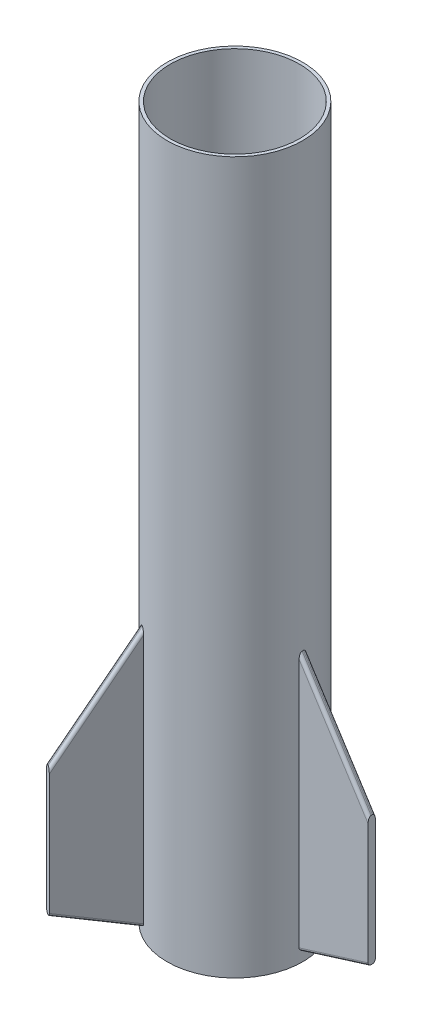
ISO-10303-21;
HEADER;
FILE_DESCRIPTION(('STEP AP214'),'2;1');
FILE_NAME('part.step','',(''),(''),'','','');
FILE_SCHEMA(('AUTOMOTIVE_DESIGN { 1 0 10303 214 1 1 1 1 }'));
ENDSEC;
DATA;
#1=APPLICATION_CONTEXT('core data for automotive mechanical design processes');
#2=APPLICATION_PROTOCOL_DEFINITION('international standard','automotive_design',2000,#1);
#3=PRODUCT_CONTEXT('',#1,'mechanical');
#4=PRODUCT('Part','Part','',(#3));
#5=PRODUCT_RELATED_PRODUCT_CATEGORY('part','',(#4));
#6=PRODUCT_DEFINITION_FORMATION('','',#4);
#7=PRODUCT_DEFINITION_CONTEXT('part definition',#1,'design');
#8=PRODUCT_DEFINITION('design','',#6,#7);
#9=PRODUCT_DEFINITION_SHAPE('','',#8);
#10=(LENGTH_UNIT() NAMED_UNIT(*) SI_UNIT(.MILLI.,.METRE.));
#11=(NAMED_UNIT(*) PLANE_ANGLE_UNIT() SI_UNIT($,.RADIAN.));
#12=(NAMED_UNIT(*) SI_UNIT($,.STERADIAN.) SOLID_ANGLE_UNIT());
#13=UNCERTAINTY_MEASURE_WITH_UNIT(LENGTH_MEASURE(1.E-05),#10,'distance_accuracy_value','');
#14=(GEOMETRIC_REPRESENTATION_CONTEXT(3) GLOBAL_UNCERTAINTY_ASSIGNED_CONTEXT((#13)) GLOBAL_UNIT_ASSIGNED_CONTEXT((#10,
#11,#12)) REPRESENTATION_CONTEXT('',''));
#15=CARTESIAN_POINT('',(0.,0.,0.));
#16=DIRECTION('',(0.,0.,1.));
#17=DIRECTION('',(1.,0.,0.));
#18=AXIS2_PLACEMENT_3D('',#15,#16,#17);
#19=CARTESIAN_POINT('',(-42.19224884677,19.05,-68.7611186881965));
#20=DIRECTION('',(-0.149137496567971,-0.95447997803503,-0.25831372136936));
#21=DIRECTION('',(-0.477239989017507,0.298274993135947,-0.826603908381953));
#22=AXIS2_PLACEMENT_3D('',#19,#20,#21);
#23=PLANE('',#22);
#24=DIRECTION('',(0.866025403784443,0.,-0.499999999999992));
#25=VECTOR('',#24,1.);
#26=CARTESIAN_POINT('',(-42.19224884677,19.05,-68.7611186881965));
#27=LINE('',#26,#25);
#28=CARTESIAN_POINT('',(-40.6524556788412,19.05,-69.6501186881964));
#29=VERTEX_POINT('',#28);
#30=CARTESIAN_POINT('',(-39.9925443211575,19.05,-70.0311186881964));
#31=VERTEX_POINT('',#30);
#32=EDGE_CURVE('E153',#29,#31,#27,.T.);
#33=ORIENTED_EDGE('',*,*,#32,.T.);
#34=DIRECTION('',(-0.477239989017507,0.298274993135947,-0.826603908381953));
#35=VECTOR('',#34,1.);
#36=CARTESIAN_POINT('',(-39.9925443211575,19.05,-70.0311186881964));
#37=LINE('',#36,#35);
#38=CARTESIAN_POINT('',(-19.6725443211578,6.35,-34.8358462783967));
#39=VERTEX_POINT('',#38);
#40=EDGE_CURVE('E121',#31,#39,#37,.F.);
#41=ORIENTED_EDGE('',*,*,#40,.T.);
#42=DIRECTION('',(0.866025403784443,0.,-0.499999999999992));
#43=VECTOR('',#42,1.);
#44=CARTESIAN_POINT('',(-21.8722488467703,6.35,-33.5658462783967));
#45=LINE('',#44,#43);
#46=CARTESIAN_POINT('',(-20.3324556788416,6.35,-34.4548462783967));
#47=VERTEX_POINT('',#46);
#48=EDGE_CURVE('E154',#47,#39,#45,.T.);
#49=ORIENTED_EDGE('',*,*,#48,.F.);
#50=DIRECTION('',(-0.477239989017507,0.298274993135947,-0.826603908381953));
#51=VECTOR('',#50,1.);
#52=CARTESIAN_POINT('',(-40.6524556788412,19.05,-69.6501186881964));
#53=LINE('',#52,#51);
#54=EDGE_CURVE('E126',#47,#29,#53,.T.);
#55=ORIENTED_EDGE('',*,*,#54,.T.);
#56=EDGE_LOOP('',(#33,#41,#49,#55));
#57=FACE_BOUND('',#56,.T.);
#58=ADVANCED_FACE('F51',(#57),#23,.T.);
#59=CARTESIAN_POINT('',(-21.8722488467703,6.35,-33.5658462783967));
#60=DIRECTION('',(0.499999999999992,0.,0.866025403784443));
#61=DIRECTION('',(0.866025403784443,0.,-0.499999999999992));
#62=AXIS2_PLACEMENT_3D('',#59,#60,#61);
#63=PLANE('',#62);
#64=ORIENTED_EDGE('',*,*,#48,.T.);
#65=CARTESIAN_POINT('',(-19.6725443211578,8.21279444400744,-34.8358462783967));
#66=DIRECTION('',(0.499999999999992,0.,0.866025403784443));
#67=DIRECTION('',(0.,1.,0.));
#68=AXIS2_PLACEMENT_3D('',#65,#66,#67);
#69=ELLIPSE('',#68,1.86279444400744,1.778);
#70=CARTESIAN_POINT('',(-18.1327511532291,8.21279444400744,-35.7248462783966));
#71=VERTEX_POINT('',#70);
#72=EDGE_CURVE('E175',#39,#71,#69,.T.);
#73=ORIENTED_EDGE('',*,*,#72,.T.);
#74=DIRECTION('',(0.,-1.,0.));
#75=VECTOR('',#74,1.);
#76=CARTESIAN_POINT('',(-18.1327511532291,6.35,-35.7248462783966));
#77=LINE('',#76,#75);
#78=CARTESIAN_POINT('',(-18.1327511532291,155.451627292796,-35.7248462783966));
#79=VERTEX_POINT('',#78);
#80=EDGE_CURVE('E137',#79,#71,#77,.T.);
#81=ORIENTED_EDGE('',*,*,#80,.F.);
#82=CARTESIAN_POINT('',(-19.6725443211578,155.451627292797,-34.8358462783967));
#83=DIRECTION('',(0.499999999999992,0.,0.866025403784443));
#84=DIRECTION('',(0.,1.,0.));
#85=AXIS2_PLACEMENT_3D('',#82,#83,#84);
#86=ELLIPSE('',#85,3.29837270720351,1.778);
#87=CARTESIAN_POINT('',(-19.6725443211578,158.75,-34.8358462783967));
#88=VERTEX_POINT('',#87);
#89=EDGE_CURVE('E171',#79,#88,#86,.T.);
#90=ORIENTED_EDGE('',*,*,#89,.T.);
#91=DIRECTION('',(0.866025403784443,0.,-0.499999999999992));
#92=VECTOR('',#91,1.);
#93=CARTESIAN_POINT('',(-21.8722488467703,158.75,-33.5658462783967));
#94=LINE('',#93,#92);
#95=CARTESIAN_POINT('',(-20.3324556788416,158.75,-34.4548462783967));
#96=VERTEX_POINT('',#95);
#97=EDGE_CURVE('E157',#96,#88,#94,.T.);
#98=ORIENTED_EDGE('',*,*,#97,.F.);
#99=CARTESIAN_POINT('',(-20.3324556788416,155.451627292797,-34.4548462783967));
#100=DIRECTION('',(0.499999999999992,0.,0.866025403784443));
#101=DIRECTION('',(0.,-1.,0.));
#102=AXIS2_PLACEMENT_3D('',#99,#100,#101);
#103=ELLIPSE('',#102,3.29837270720351,1.778);
#104=CARTESIAN_POINT('',(-21.8722488467703,155.451627292796,-33.5658462783967));
#105=VERTEX_POINT('',#104);
#106=EDGE_CURVE('E73',#96,#105,#103,.T.);
#107=ORIENTED_EDGE('',*,*,#106,.T.);
#108=DIRECTION('',(0.,-1.,0.));
#109=VECTOR('',#108,1.);
#110=CARTESIAN_POINT('',(-21.8722488467703,6.35,-33.5658462783967));
#111=LINE('',#110,#109);
#112=CARTESIAN_POINT('',(-21.8722488467703,8.21279444400744,-33.5658462783967));
#113=VERTEX_POINT('',#112);
#114=EDGE_CURVE('E151',#105,#113,#111,.T.);
#115=ORIENTED_EDGE('',*,*,#114,.T.);
#116=CARTESIAN_POINT('',(-20.3324556788416,8.21279444400744,-34.4548462783967));
#117=DIRECTION('',(0.499999999999992,0.,0.866025403784443));
#118=DIRECTION('',(0.,-1.,0.));
#119=AXIS2_PLACEMENT_3D('',#116,#117,#118);
#120=ELLIPSE('',#119,1.86279444400744,1.778);
#121=EDGE_CURVE('E173',#113,#47,#120,.T.);
#122=ORIENTED_EDGE('',*,*,#121,.T.);
#123=EDGE_LOOP('',(#64,#73,#81,#90,#98,#107,#115,#122));
#124=FACE_BOUND('',#123,.T.);
#125=ADVANCED_FACE('F187',(#124),#63,.T.);
#126=CARTESIAN_POINT('',(-21.8722488467703,158.75,-33.5658462783967));
#127=DIRECTION('',(-0.421135700330749,0.539053696423367,-0.729428429853974));
#128=DIRECTION('',(0.269526848211679,0.842271400661511,0.466834195106543));
#129=AXIS2_PLACEMENT_3D('',#126,#127,#128);
#130=PLANE('',#129);
#131=ORIENTED_EDGE('',*,*,#97,.T.);
#132=DIRECTION('',(0.269526848211679,0.842271400661511,0.466834195106543));
#133=VECTOR('',#132,1.);
#134=CARTESIAN_POINT('',(-19.6725443211578,158.75,-34.8358462783967));
#135=LINE('',#134,#133);
#136=CARTESIAN_POINT('',(-39.9925443211575,95.25,-70.0311186881964));
#137=VERTEX_POINT('',#136);
#138=EDGE_CURVE('E12',#88,#137,#135,.F.);
#139=ORIENTED_EDGE('',*,*,#138,.T.);
#140=DIRECTION('',(0.866025403784443,0.,-0.499999999999992));
#141=VECTOR('',#140,1.);
#142=CARTESIAN_POINT('',(-42.19224884677,95.25,-68.7611186881964));
#143=LINE('',#142,#141);
#144=CARTESIAN_POINT('',(-40.6524556788412,95.25,-69.6501186881964));
#145=VERTEX_POINT('',#144);
#146=EDGE_CURVE('E160',#145,#137,#143,.T.);
#147=ORIENTED_EDGE('',*,*,#146,.F.);
#148=DIRECTION('',(0.269526848211679,0.842271400661511,0.466834195106543));
#149=VECTOR('',#148,1.);
#150=CARTESIAN_POINT('',(-20.3324556788416,158.75,-34.4548462783967));
#151=LINE('',#150,#149);
#152=EDGE_CURVE('E59',#145,#96,#151,.T.);
#153=ORIENTED_EDGE('',*,*,#152,.T.);
#154=EDGE_LOOP('',(#131,#139,#147,#153));
#155=FACE_BOUND('',#154,.T.);
#156=ADVANCED_FACE('F183',(#155),#130,.T.);
#157=CARTESIAN_POINT('',(-42.19224884677,95.25,-68.7611186881964));
#158=DIRECTION('',(-0.499999999999992,0.,-0.866025403784443));
#159=DIRECTION('',(0.,1.,0.));
#160=AXIS2_PLACEMENT_3D('',#157,#158,#159);
#161=PLANE('',#160);
#162=DIRECTION('',(0.,1.,0.));
#163=VECTOR('',#162,1.);
#164=CARTESIAN_POINT('',(-38.4527511532287,95.25,-70.9201186881964));
#165=LINE('',#164,#163);
#166=CARTESIAN_POINT('',(-38.4527511532287,20.9127944440075,-70.9201186881964));
#167=VERTEX_POINT('',#166);
#168=CARTESIAN_POINT('',(-38.4527511532287,91.9516272927965,-70.9201186881964));
#169=VERTEX_POINT('',#168);
#170=EDGE_CURVE('E134',#167,#169,#165,.T.);
#171=ORIENTED_EDGE('',*,*,#170,.F.);
#172=CARTESIAN_POINT('',(-39.9925443211575,20.9127944440074,-70.0311186881964));
#173=DIRECTION('',(-0.499999999999992,0.,-0.866025403784443));
#174=DIRECTION('',(0.,1.,0.));
#175=AXIS2_PLACEMENT_3D('',#172,#173,#174);
#176=ELLIPSE('',#175,1.86279444400744,1.778);
#177=EDGE_CURVE('E116',#167,#31,#176,.T.);
#178=ORIENTED_EDGE('',*,*,#177,.T.);
#179=ORIENTED_EDGE('',*,*,#32,.F.);
#180=CARTESIAN_POINT('',(-40.6524556788412,20.9127944440074,-69.6501186881964));
#181=DIRECTION('',(-0.499999999999992,0.,-0.866025403784443));
#182=DIRECTION('',(0.,-1.,0.));
#183=AXIS2_PLACEMENT_3D('',#180,#181,#182);
#184=ELLIPSE('',#183,1.86279444400744,1.778);
#185=CARTESIAN_POINT('',(-42.19224884677,20.9127944440075,-68.7611186881965));
#186=VERTEX_POINT('',#185);
#187=EDGE_CURVE('E127',#29,#186,#184,.T.);
#188=ORIENTED_EDGE('',*,*,#187,.T.);
#189=DIRECTION('',(0.,1.,0.));
#190=VECTOR('',#189,1.);
#191=CARTESIAN_POINT('',(-42.19224884677,95.25,-68.7611186881964));
#192=LINE('',#191,#190);
#193=CARTESIAN_POINT('',(-42.19224884677,91.9516272927965,-68.7611186881964));
#194=VERTEX_POINT('',#193);
#195=EDGE_CURVE('E146',#186,#194,#192,.T.);
#196=ORIENTED_EDGE('',*,*,#195,.T.);
#197=CARTESIAN_POINT('',(-40.6524556788412,91.9516272927965,-69.6501186881964));
#198=DIRECTION('',(-0.499999999999992,0.,-0.866025403784443));
#199=DIRECTION('',(0.,-1.,0.));
#200=AXIS2_PLACEMENT_3D('',#197,#198,#199);
#201=ELLIPSE('',#200,3.29837270720351,1.778);
#202=EDGE_CURVE('E138',#194,#145,#201,.T.);
#203=ORIENTED_EDGE('',*,*,#202,.T.);
#204=ORIENTED_EDGE('',*,*,#146,.T.);
#205=CARTESIAN_POINT('',(-39.9925443211575,91.9516272927965,-70.0311186881964));
#206=DIRECTION('',(-0.499999999999992,0.,-0.866025403784443));
#207=DIRECTION('',(0.,1.,0.));
#208=AXIS2_PLACEMENT_3D('',#205,#206,#207);
#209=ELLIPSE('',#208,3.29837270720351,1.778);
#210=EDGE_CURVE('E144',#137,#169,#209,.T.);
#211=ORIENTED_EDGE('',*,*,#210,.T.);
#212=EDGE_LOOP('',(#171,#178,#179,#188,#196,#203,#204,#211));
#213=FACE_BOUND('',#212,.T.);
#214=ADVANCED_FACE('F141',(#213),#161,.T.);
#215=CARTESIAN_POINT('',(-1.86974884677061,0.,1.07949999999998));
#216=DIRECTION('',(0.866025403784443,0.,-0.499999999999992));
#217=DIRECTION('',(-0.499999999999992,0.,-0.866025403784443));
#218=AXIS2_PLACEMENT_3D('',#215,#216,#217);
#219=PLANE('',#218);
#220=ORIENTED_EDGE('',*,*,#195,.F.);
#221=DIRECTION('',(-0.477239989017507,0.298274993135947,-0.826603908381953));
#222=VECTOR('',#221,1.);
#223=CARTESIAN_POINT('',(-21.6070823778724,8.04706540094628,-33.1065644818019));
#224=LINE('',#223,#222);
#225=EDGE_CURVE('E66',#186,#113,#224,.F.);
#226=ORIENTED_EDGE('',*,*,#225,.T.);
#227=ORIENTED_EDGE('',*,*,#114,.F.);
#228=DIRECTION('',(0.269526848211679,0.842271400661512,0.466834195106543));
#229=VECTOR('',#228,1.);
#230=CARTESIAN_POINT('',(-41.4434695715819,94.2915625277593,-67.4641949399161));
#231=LINE('',#230,#229);
#232=EDGE_CURVE('E177',#105,#194,#231,.F.);
#233=ORIENTED_EDGE('',*,*,#232,.T.);
#234=EDGE_LOOP('',(#220,#226,#227,#233));
#235=FACE_BOUND('',#234,.T.);
#236=ADVANCED_FACE('F191',(#235),#219,.F.);
#237=CARTESIAN_POINT('',(1.86974884677061,0.,-1.07949999999998));
#238=DIRECTION('',(0.866025403784443,0.,-0.499999999999992));
#239=DIRECTION('',(-0.499999999999992,0.,-0.866025403784443));
#240=AXIS2_PLACEMENT_3D('',#237,#238,#239);
#241=PLANE('',#240);
#242=ORIENTED_EDGE('',*,*,#80,.T.);
#243=DIRECTION('',(-0.477239989017507,0.298274993135947,-0.826603908381953));
#244=VECTOR('',#243,1.);
#245=CARTESIAN_POINT('',(1.259248055882,-3.90720506168717,-2.13691838788006));
#246=LINE('',#245,#244);
#247=EDGE_CURVE('E120',#71,#167,#246,.T.);
#248=ORIENTED_EDGE('',*,*,#247,.T.);
#249=ORIENTED_EDGE('',*,*,#170,.T.);
#250=DIRECTION('',(0.269526848211679,0.842271400661512,0.466834195106543));
#251=VECTOR('',#250,1.);
#252=CARTESIAN_POINT('',(-47.6102601867806,63.3344115629465,-86.7813896050795));
#253=LINE('',#252,#251);
#254=EDGE_CURVE('E139',#169,#79,#253,.T.);
#255=ORIENTED_EDGE('',*,*,#254,.T.);
#256=EDGE_LOOP('',(#242,#248,#249,#255));
#257=FACE_BOUND('',#256,.T.);
#258=ADVANCED_FACE('F132',(#257),#241,.T.);
#259=CARTESIAN_POINT('',(-0.280545112046737,-3.90720506168717,-1.24791838788008));
#260=DIRECTION('',(-0.477239989017507,0.298274993135947,-0.826603908381953));
#261=DIRECTION('',(0.149137496567971,0.95447997803503,0.25831372136936));
#262=AXIS2_PLACEMENT_3D('',#259,#260,#261);
#263=CYLINDRICAL_SURFACE('',#262,1.778);
#264=ORIENTED_EDGE('',*,*,#72,.F.);
#265=ORIENTED_EDGE('',*,*,#40,.F.);
#266=ORIENTED_EDGE('',*,*,#177,.F.);
#267=ORIENTED_EDGE('',*,*,#247,.F.);
#268=EDGE_LOOP('',(#264,#265,#266,#267));
#269=FACE_BOUND('',#268,.T.);
#270=ADVANCED_FACE('F119',(#269),#263,.T.);
#271=CARTESIAN_POINT('',(-40.3872892099434,20.7470654009463,-69.1908368916017));
#272=DIRECTION('',(0.477239989017507,-0.298274993135947,0.826603908381953));
#273=DIRECTION('',(-0.149137496567971,-0.95447997803503,-0.25831372136936));
#274=AXIS2_PLACEMENT_3D('',#271,#272,#273);
#275=CYLINDRICAL_SURFACE('',#274,1.778);
#276=ORIENTED_EDGE('',*,*,#121,.F.);
#277=ORIENTED_EDGE('',*,*,#225,.F.);
#278=ORIENTED_EDGE('',*,*,#187,.F.);
#279=ORIENTED_EDGE('',*,*,#54,.F.);
#280=EDGE_LOOP('',(#276,#277,#278,#279));
#281=FACE_BOUND('',#280,.T.);
#282=ADVANCED_FACE('F196',(#281),#275,.T.);
#283=CARTESIAN_POINT('',(-49.1500533547093,63.3344115629465,-85.8923896050795));
#284=DIRECTION('',(0.269526848211679,0.842271400661512,0.466834195106543));
#285=DIRECTION('',(0.421135700330749,-0.539053696423367,0.729428429853974));
#286=AXIS2_PLACEMENT_3D('',#283,#284,#285);
#287=CYLINDRICAL_SURFACE('',#286,1.778);
#288=ORIENTED_EDGE('',*,*,#210,.F.);
#289=ORIENTED_EDGE('',*,*,#138,.F.);
#290=ORIENTED_EDGE('',*,*,#89,.F.);
#291=ORIENTED_EDGE('',*,*,#254,.F.);
#292=EDGE_LOOP('',(#288,#289,#290,#291));
#293=FACE_BOUND('',#292,.T.);
#294=ADVANCED_FACE('F189',(#293),#287,.T.);
#295=CARTESIAN_POINT('',(-19.5836764036535,157.791562527759,-33.1579225301163));
#296=DIRECTION('',(-0.269526848211679,-0.842271400661512,-0.466834195106543));
#297=DIRECTION('',(-0.421135700330749,0.539053696423367,-0.729428429853974));
#298=AXIS2_PLACEMENT_3D('',#295,#296,#297);
#299=CYLINDRICAL_SURFACE('',#298,1.778);
#300=ORIENTED_EDGE('',*,*,#202,.F.);
#301=ORIENTED_EDGE('',*,*,#232,.F.);
#302=ORIENTED_EDGE('',*,*,#106,.F.);
#303=ORIENTED_EDGE('',*,*,#152,.F.);
#304=EDGE_LOOP('',(#300,#301,#302,#303));
#305=FACE_BOUND('',#304,.T.);
#306=ADVANCED_FACE('F53',(#305),#299,.T.);
#307=CLOSED_SHELL('',(#58,#125,#156,#214,#236,#258,#270,#282,#294,#306));
#308=MANIFOLD_SOLID_BREP('B2',#307);
#309=CARTESIAN_POINT('',(-38.4527511532297,19.05,70.9201186881959));
#310=DIRECTION('',(-0.149137496567975,-0.95447997803503,0.258313721369358));
#311=DIRECTION('',(-0.477239989017519,0.298274993135947,0.826603908381947));
#312=AXIS2_PLACEMENT_3D('',#309,#310,#311);
#313=PLANE('',#312);
#314=DIRECTION('',(-0.866025403784436,0.,-0.500000000000004));
#315=VECTOR('',#314,1.);
#316=CARTESIAN_POINT('',(-38.4527511532297,19.05,70.9201186881959));
#317=LINE('',#316,#315);
#318=CARTESIAN_POINT('',(-39.9925443211585,19.05,70.0311186881959));
#319=VERTEX_POINT('',#318);
#320=CARTESIAN_POINT('',(-40.6524556788422,19.05,69.6501186881959));
#321=VERTEX_POINT('',#320);
#322=EDGE_CURVE('E392',#319,#321,#317,.T.);
#323=ORIENTED_EDGE('',*,*,#322,.T.);
#324=DIRECTION('',(-0.477239989017519,0.298274993135947,0.826603908381947));
#325=VECTOR('',#324,1.);
#326=CARTESIAN_POINT('',(-40.6524556788422,19.05,69.6501186881959));
#327=LINE('',#326,#325);
#328=CARTESIAN_POINT('',(-20.332455678842,6.35,34.4548462783964));
#329=VERTEX_POINT('',#328);
#330=EDGE_CURVE('E360',#321,#329,#327,.F.);
#331=ORIENTED_EDGE('',*,*,#330,.T.);
#332=DIRECTION('',(-0.866025403784436,0.,-0.500000000000004));
#333=VECTOR('',#332,1.);
#334=CARTESIAN_POINT('',(-18.1327511532296,6.35,35.7248462783964));
#335=LINE('',#334,#333);
#336=CARTESIAN_POINT('',(-19.6725443211583,6.35,34.8358462783964));
#337=VERTEX_POINT('',#336);
#338=EDGE_CURVE('E393',#337,#329,#335,.T.);
#339=ORIENTED_EDGE('',*,*,#338,.F.);
#340=DIRECTION('',(-0.477239989017519,0.298274993135947,0.826603908381947));
#341=VECTOR('',#340,1.);
#342=CARTESIAN_POINT('',(-39.9925443211585,19.05,70.0311186881959));
#343=LINE('',#342,#341);
#344=EDGE_CURVE('E365',#337,#319,#343,.T.);
#345=ORIENTED_EDGE('',*,*,#344,.T.);
#346=EDGE_LOOP('',(#323,#331,#339,#345));
#347=FACE_BOUND('',#346,.T.);
#348=ADVANCED_FACE('F290',(#347),#313,.T.);
#349=CARTESIAN_POINT('',(-18.1327511532296,6.35,35.7248462783964));
#350=DIRECTION('',(0.500000000000004,0.,-0.866025403784436));
#351=DIRECTION('',(-0.866025403784436,0.,-0.500000000000004));
#352=AXIS2_PLACEMENT_3D('',#349,#350,#351);
#353=PLANE('',#352);
#354=ORIENTED_EDGE('',*,*,#338,.T.);
#355=CARTESIAN_POINT('',(-20.332455678842,8.21279444400744,34.4548462783964));
#356=DIRECTION('',(0.500000000000004,0.,-0.866025403784436));
#357=DIRECTION('',(0.,1.,0.));
#358=AXIS2_PLACEMENT_3D('',#355,#356,#357);
#359=ELLIPSE('',#358,1.86279444400744,1.778);
#360=CARTESIAN_POINT('',(-21.8722488467708,8.21279444400744,33.5658462783964));
#361=VERTEX_POINT('',#360);
#362=EDGE_CURVE('E414',#329,#361,#359,.T.);
#363=ORIENTED_EDGE('',*,*,#362,.T.);
#364=DIRECTION('',(0.,-1.,0.));
#365=VECTOR('',#364,1.);
#366=CARTESIAN_POINT('',(-21.8722488467708,6.35,33.5658462783964));
#367=LINE('',#366,#365);
#368=CARTESIAN_POINT('',(-21.8722488467708,155.451627292796,33.5658462783964));
#369=VERTEX_POINT('',#368);
#370=EDGE_CURVE('E376',#369,#361,#367,.T.);
#371=ORIENTED_EDGE('',*,*,#370,.F.);
#372=CARTESIAN_POINT('',(-20.332455678842,155.451627292797,34.4548462783964));
#373=DIRECTION('',(0.500000000000004,0.,-0.866025403784436));
#374=DIRECTION('',(0.,1.,0.));
#375=AXIS2_PLACEMENT_3D('',#372,#373,#374);
#376=ELLIPSE('',#375,3.29837270720351,1.778);
#377=CARTESIAN_POINT('',(-20.332455678842,158.75,34.4548462783964));
#378=VERTEX_POINT('',#377);
#379=EDGE_CURVE('E410',#369,#378,#376,.T.);
#380=ORIENTED_EDGE('',*,*,#379,.T.);
#381=DIRECTION('',(-0.866025403784436,0.,-0.500000000000004));
#382=VECTOR('',#381,1.);
#383=CARTESIAN_POINT('',(-18.1327511532296,158.75,35.7248462783964));
#384=LINE('',#383,#382);
#385=CARTESIAN_POINT('',(-19.6725443211583,158.75,34.8358462783964));
#386=VERTEX_POINT('',#385);
#387=EDGE_CURVE('E396',#386,#378,#384,.T.);
#388=ORIENTED_EDGE('',*,*,#387,.F.);
#389=CARTESIAN_POINT('',(-19.6725443211583,155.451627292797,34.8358462783964));
#390=DIRECTION('',(0.500000000000004,0.,-0.866025403784436));
#391=DIRECTION('',(0.,-1.,0.));
#392=AXIS2_PLACEMENT_3D('',#389,#390,#391);
#393=ELLIPSE('',#392,3.29837270720351,1.778);
#394=CARTESIAN_POINT('',(-18.1327511532296,155.451627292796,35.7248462783964));
#395=VERTEX_POINT('',#394);
#396=EDGE_CURVE('E312',#386,#395,#393,.T.);
#397=ORIENTED_EDGE('',*,*,#396,.T.);
#398=DIRECTION('',(0.,-1.,0.));
#399=VECTOR('',#398,1.);
#400=CARTESIAN_POINT('',(-18.1327511532296,6.35,35.7248462783964));
#401=LINE('',#400,#399);
#402=CARTESIAN_POINT('',(-18.1327511532296,8.21279444400744,35.7248462783964));
#403=VERTEX_POINT('',#402);
#404=EDGE_CURVE('E390',#395,#403,#401,.T.);
#405=ORIENTED_EDGE('',*,*,#404,.T.);
#406=CARTESIAN_POINT('',(-19.6725443211583,8.21279444400744,34.8358462783964));
#407=DIRECTION('',(0.500000000000004,0.,-0.866025403784436));
#408=DIRECTION('',(0.,-1.,0.));
#409=AXIS2_PLACEMENT_3D('',#406,#407,#408);
#410=ELLIPSE('',#409,1.86279444400744,1.778);
#411=EDGE_CURVE('E412',#403,#337,#410,.T.);
#412=ORIENTED_EDGE('',*,*,#411,.T.);
#413=EDGE_LOOP('',(#354,#363,#371,#380,#388,#397,#405,#412));
#414=FACE_BOUND('',#413,.T.);
#415=ADVANCED_FACE('F426',(#414),#353,.T.);
#416=CARTESIAN_POINT('',(-18.1327511532296,158.75,35.7248462783964));
#417=DIRECTION('',(-0.421135700330759,0.539053696423367,0.729428429853968));
#418=DIRECTION('',(0.269526848211686,0.842271400661511,-0.46683419510654));
#419=AXIS2_PLACEMENT_3D('',#416,#417,#418);
#420=PLANE('',#419);
#421=ORIENTED_EDGE('',*,*,#387,.T.);
#422=DIRECTION('',(0.269526848211686,0.842271400661511,-0.46683419510654));
#423=VECTOR('',#422,1.);
#424=CARTESIAN_POINT('',(-20.332455678842,158.75,34.4548462783964));
#425=LINE('',#424,#423);
#426=CARTESIAN_POINT('',(-40.6524556788422,95.25,69.6501186881959));
#427=VERTEX_POINT('',#426);
#428=EDGE_CURVE('E49',#378,#427,#425,.F.);
#429=ORIENTED_EDGE('',*,*,#428,.T.);
#430=DIRECTION('',(-0.866025403784436,0.,-0.500000000000004));
#431=VECTOR('',#430,1.);
#432=CARTESIAN_POINT('',(-38.4527511532297,95.25,70.9201186881959));
#433=LINE('',#432,#431);
#434=CARTESIAN_POINT('',(-39.9925443211585,95.25,70.0311186881959));
#435=VERTEX_POINT('',#434);
#436=EDGE_CURVE('E399',#435,#427,#433,.T.);
#437=ORIENTED_EDGE('',*,*,#436,.F.);
#438=DIRECTION('',(0.269526848211686,0.842271400661511,-0.46683419510654));
#439=VECTOR('',#438,1.);
#440=CARTESIAN_POINT('',(-19.6725443211583,158.75,34.8358462783964));
#441=LINE('',#440,#439);
#442=EDGE_CURVE('E298',#435,#386,#441,.T.);
#443=ORIENTED_EDGE('',*,*,#442,.T.);
#444=EDGE_LOOP('',(#421,#429,#437,#443));
#445=FACE_BOUND('',#444,.T.);
#446=ADVANCED_FACE('F422',(#445),#420,.T.);
#447=CARTESIAN_POINT('',(-38.4527511532297,95.25,70.9201186881959));
#448=DIRECTION('',(-0.500000000000004,0.,0.866025403784436));
#449=DIRECTION('',(0.,1.,0.));
#450=AXIS2_PLACEMENT_3D('',#447,#448,#449);
#451=PLANE('',#450);
#452=DIRECTION('',(0.,1.,0.));
#453=VECTOR('',#452,1.);
#454=CARTESIAN_POINT('',(-42.1922488467709,95.25,68.7611186881959));
#455=LINE('',#454,#453);
#456=CARTESIAN_POINT('',(-42.1922488467709,20.9127944440075,68.7611186881959));
#457=VERTEX_POINT('',#456);
#458=CARTESIAN_POINT('',(-42.1922488467709,91.9516272927965,68.7611186881959));
#459=VERTEX_POINT('',#458);
#460=EDGE_CURVE('E373',#457,#459,#455,.T.);
#461=ORIENTED_EDGE('',*,*,#460,.F.);
#462=CARTESIAN_POINT('',(-40.6524556788422,20.9127944440074,69.6501186881959));
#463=DIRECTION('',(-0.500000000000004,0.,0.866025403784436));
#464=DIRECTION('',(0.,1.,0.));
#465=AXIS2_PLACEMENT_3D('',#462,#463,#464);
#466=ELLIPSE('',#465,1.86279444400744,1.778);
#467=EDGE_CURVE('E355',#457,#321,#466,.T.);
#468=ORIENTED_EDGE('',*,*,#467,.T.);
#469=ORIENTED_EDGE('',*,*,#322,.F.);
#470=CARTESIAN_POINT('',(-39.9925443211585,20.9127944440074,70.0311186881959));
#471=DIRECTION('',(-0.500000000000004,0.,0.866025403784436));
#472=DIRECTION('',(0.,-1.,0.));
#473=AXIS2_PLACEMENT_3D('',#470,#471,#472);
#474=ELLIPSE('',#473,1.86279444400744,1.778);
#475=CARTESIAN_POINT('',(-38.4527511532297,20.9127944440075,70.9201186881959));
#476=VERTEX_POINT('',#475);
#477=EDGE_CURVE('E366',#319,#476,#474,.T.);
#478=ORIENTED_EDGE('',*,*,#477,.T.);
#479=DIRECTION('',(0.,1.,0.));
#480=VECTOR('',#479,1.);
#481=CARTESIAN_POINT('',(-38.4527511532297,95.25,70.9201186881959));
#482=LINE('',#481,#480);
#483=CARTESIAN_POINT('',(-38.4527511532297,91.9516272927965,70.9201186881959));
#484=VERTEX_POINT('',#483);
#485=EDGE_CURVE('E385',#476,#484,#482,.T.);
#486=ORIENTED_EDGE('',*,*,#485,.T.);
#487=CARTESIAN_POINT('',(-39.9925443211585,91.9516272927965,70.0311186881959));
#488=DIRECTION('',(-0.500000000000004,0.,0.866025403784436));
#489=DIRECTION('',(0.,-1.,0.));
#490=AXIS2_PLACEMENT_3D('',#487,#488,#489);
#491=ELLIPSE('',#490,3.29837270720351,1.778);
#492=EDGE_CURVE('E377',#484,#435,#491,.T.);
#493=ORIENTED_EDGE('',*,*,#492,.T.);
#494=ORIENTED_EDGE('',*,*,#436,.T.);
#495=CARTESIAN_POINT('',(-40.6524556788422,91.9516272927965,69.6501186881959));
#496=DIRECTION('',(-0.500000000000004,0.,0.866025403784436));
#497=DIRECTION('',(0.,1.,0.));
#498=AXIS2_PLACEMENT_3D('',#495,#496,#497);
#499=ELLIPSE('',#498,3.29837270720351,1.778);
#500=EDGE_CURVE('E383',#427,#459,#499,.T.);
#501=ORIENTED_EDGE('',*,*,#500,.T.);
#502=EDGE_LOOP('',(#461,#468,#469,#478,#486,#493,#494,#501));
#503=FACE_BOUND('',#502,.T.);
#504=ADVANCED_FACE('F380',(#503),#451,.T.);
#505=CARTESIAN_POINT('',(1.8697488467706,0.,1.07950000000001));
#506=DIRECTION('',(-0.866025403784436,0.,-0.500000000000004));
#507=DIRECTION('',(-0.500000000000004,0.,0.866025403784436));
#508=AXIS2_PLACEMENT_3D('',#505,#506,#507);
#509=PLANE('',#508);
#510=ORIENTED_EDGE('',*,*,#485,.F.);
#511=DIRECTION('',(-0.477239989017519,0.298274993135947,0.826603908381947));
#512=VECTOR('',#511,1.);
#513=CARTESIAN_POINT('',(-17.8675846843317,8.04706540094628,35.2655644818017));
#514=LINE('',#513,#512);
#515=EDGE_CURVE('E305',#476,#403,#514,.F.);
#516=ORIENTED_EDGE('',*,*,#515,.T.);
#517=ORIENTED_EDGE('',*,*,#404,.F.);
#518=DIRECTION('',(0.269526848211686,0.842271400661512,-0.46683419510654));
#519=VECTOR('',#518,1.);
#520=CARTESIAN_POINT('',(-37.7039718780416,94.2915625277593,69.6231949399155));
#521=LINE('',#520,#519);
#522=EDGE_CURVE('E416',#395,#484,#521,.F.);
#523=ORIENTED_EDGE('',*,*,#522,.T.);
#524=EDGE_LOOP('',(#510,#516,#517,#523));
#525=FACE_BOUND('',#524,.T.);
#526=ADVANCED_FACE('F430',(#525),#509,.F.);
#527=CARTESIAN_POINT('',(-1.8697488467706,0.,-1.07950000000001));
#528=DIRECTION('',(-0.866025403784436,0.,-0.500000000000004));
#529=DIRECTION('',(-0.500000000000004,0.,0.866025403784436));
#530=AXIS2_PLACEMENT_3D('',#527,#528,#529);
#531=PLANE('',#530);
#532=ORIENTED_EDGE('',*,*,#370,.T.);
#533=DIRECTION('',(-0.477239989017519,0.298274993135947,0.826603908381947));
#534=VECTOR('',#533,1.);
#535=CARTESIAN_POINT('',(-2.48024963765922,-3.90720506168717,-0.0220816121199391));
#536=LINE('',#535,#534);
#537=EDGE_CURVE('E359',#361,#457,#536,.T.);
#538=ORIENTED_EDGE('',*,*,#537,.T.);
#539=ORIENTED_EDGE('',*,*,#460,.T.);
#540=DIRECTION('',(0.269526848211686,0.842271400661512,-0.46683419510654));
#541=VECTOR('',#540,1.);
#542=CARTESIAN_POINT('',(-51.349757880323,63.3344115629465,84.6223896050788));
#543=LINE('',#542,#541);
#544=EDGE_CURVE('E378',#459,#369,#543,.T.);
#545=ORIENTED_EDGE('',*,*,#544,.T.);
#546=EDGE_LOOP('',(#532,#538,#539,#545));
#547=FACE_BOUND('',#546,.T.);
#548=ADVANCED_FACE('F371',(#547),#531,.T.);
#549=CARTESIAN_POINT('',(-0.940456469730495,-3.90720506168717,0.866918387880068));
#550=DIRECTION('',(-0.477239989017519,0.298274993135947,0.826603908381947));
#551=DIRECTION('',(0.149137496567975,0.95447997803503,-0.258313721369358));
#552=AXIS2_PLACEMENT_3D('',#549,#550,#551);
#553=CYLINDRICAL_SURFACE('',#552,1.778);
#554=ORIENTED_EDGE('',*,*,#362,.F.);
#555=ORIENTED_EDGE('',*,*,#330,.F.);
#556=ORIENTED_EDGE('',*,*,#467,.F.);
#557=ORIENTED_EDGE('',*,*,#537,.F.);
#558=EDGE_LOOP('',(#554,#555,#556,#557));
#559=FACE_BOUND('',#558,.T.);
#560=ADVANCED_FACE('F358',(#559),#553,.T.);
#561=CARTESIAN_POINT('',(-39.7273778522606,20.7470654009463,69.5718368916012));
#562=DIRECTION('',(0.477239989017519,-0.298274993135947,-0.826603908381947));
#563=DIRECTION('',(-0.149137496567975,-0.95447997803503,0.258313721369358));
#564=AXIS2_PLACEMENT_3D('',#561,#562,#563);
#565=CYLINDRICAL_SURFACE('',#564,1.778);
#566=ORIENTED_EDGE('',*,*,#411,.F.);
#567=ORIENTED_EDGE('',*,*,#515,.F.);
#568=ORIENTED_EDGE('',*,*,#477,.F.);
#569=ORIENTED_EDGE('',*,*,#344,.F.);
#570=EDGE_LOOP('',(#566,#567,#568,#569));
#571=FACE_BOUND('',#570,.T.);
#572=ADVANCED_FACE('F435',(#571),#565,.T.);
#573=CARTESIAN_POINT('',(-49.8099647123943,63.3344115629465,85.5113896050789));
#574=DIRECTION('',(0.269526848211686,0.842271400661512,-0.46683419510654));
#575=DIRECTION('',(0.421135700330759,-0.539053696423367,-0.729428429853968));
#576=AXIS2_PLACEMENT_3D('',#573,#574,#575);
#577=CYLINDRICAL_SURFACE('',#576,1.778);
#578=ORIENTED_EDGE('',*,*,#500,.F.);
#579=ORIENTED_EDGE('',*,*,#428,.F.);
#580=ORIENTED_EDGE('',*,*,#379,.F.);
#581=ORIENTED_EDGE('',*,*,#544,.F.);
#582=EDGE_LOOP('',(#578,#579,#580,#581));
#583=FACE_BOUND('',#582,.T.);
#584=ADVANCED_FACE('F428',(#583),#577,.T.);
#585=CARTESIAN_POINT('',(-18.9237650459702,157.791562527759,33.538922530116));
#586=DIRECTION('',(-0.269526848211686,-0.842271400661512,0.46683419510654));
#587=DIRECTION('',(-0.421135700330759,0.539053696423367,0.729428429853968));
#588=AXIS2_PLACEMENT_3D('',#585,#586,#587);
#589=CYLINDRICAL_SURFACE('',#588,1.778);
#590=ORIENTED_EDGE('',*,*,#492,.F.);
#591=ORIENTED_EDGE('',*,*,#522,.F.);
#592=ORIENTED_EDGE('',*,*,#396,.F.);
#593=ORIENTED_EDGE('',*,*,#442,.F.);
#594=EDGE_LOOP('',(#590,#591,#592,#593));
#595=FACE_BOUND('',#594,.T.);
#596=ADVANCED_FACE('F292',(#595),#589,.T.);
#597=CLOSED_SHELL('',(#348,#415,#446,#504,#526,#548,#560,#572,#584,#596));
#598=MANIFOLD_SOLID_BREP('B6',#597);
#599=CARTESIAN_POINT('',(80.645,19.05,-2.159));
#600=DIRECTION('',(0.298274993135947,-0.95447997803503,0.));
#601=DIRECTION('',(0.95447997803503,0.298274993135947,0.));
#602=AXIS2_PLACEMENT_3D('',#599,#600,#601);
#603=PLANE('',#602);
#604=DIRECTION('',(0.,0.,1.));
#605=VECTOR('',#604,1.);
#606=CARTESIAN_POINT('',(80.645,19.05,-2.159));
#607=LINE('',#606,#605);
#608=CARTESIAN_POINT('',(80.645,19.05,-0.381));
#609=VERTEX_POINT('',#608);
#610=CARTESIAN_POINT('',(80.645,19.05,0.381));
#611=VERTEX_POINT('',#610);
#612=EDGE_CURVE('E628',#609,#611,#607,.T.);
#613=ORIENTED_EDGE('',*,*,#612,.T.);
#614=DIRECTION('',(0.95447997803503,0.298274993135947,0.));
#615=VECTOR('',#614,1.);
#616=CARTESIAN_POINT('',(80.645,19.05,0.381));
#617=LINE('',#616,#615);
#618=CARTESIAN_POINT('',(40.005,6.35,0.381));
#619=VERTEX_POINT('',#618);
#620=EDGE_CURVE('E596',#611,#619,#617,.F.);
#621=ORIENTED_EDGE('',*,*,#620,.T.);
#622=DIRECTION('',(0.,0.,1.));
#623=VECTOR('',#622,1.);
#624=CARTESIAN_POINT('',(40.005,6.35,-2.159));
#625=LINE('',#624,#623);
#626=CARTESIAN_POINT('',(40.005,6.35,-0.381));
#627=VERTEX_POINT('',#626);
#628=EDGE_CURVE('E629',#627,#619,#625,.T.);
#629=ORIENTED_EDGE('',*,*,#628,.F.);
#630=DIRECTION('',(0.95447997803503,0.298274993135947,0.));
#631=VECTOR('',#630,1.);
#632=CARTESIAN_POINT('',(80.645,19.05,-0.381));
#633=LINE('',#632,#631);
#634=EDGE_CURVE('E601',#627,#609,#633,.T.);
#635=ORIENTED_EDGE('',*,*,#634,.T.);
#636=EDGE_LOOP('',(#613,#621,#629,#635));
#637=FACE_BOUND('',#636,.T.);
#638=ADVANCED_FACE('F526',(#637),#603,.T.);
#639=CARTESIAN_POINT('',(40.005,6.35,-2.159));
#640=DIRECTION('',(-1.,0.,0.));
#641=DIRECTION('',(0.,0.,1.));
#642=AXIS2_PLACEMENT_3D('',#639,#640,#641);
#643=PLANE('',#642);
#644=ORIENTED_EDGE('',*,*,#628,.T.);
#645=CARTESIAN_POINT('',(40.005,8.21279444400744,0.381));
#646=DIRECTION('',(-1.,0.,0.));
#647=DIRECTION('',(0.,1.,0.));
#648=AXIS2_PLACEMENT_3D('',#645,#646,#647);
#649=ELLIPSE('',#648,1.86279444400744,1.778);
#650=CARTESIAN_POINT('',(40.005,8.21279444400744,2.159));
#651=VERTEX_POINT('',#650);
#652=EDGE_CURVE('E650',#619,#651,#649,.T.);
#653=ORIENTED_EDGE('',*,*,#652,.T.);
#654=DIRECTION('',(0.,-1.,0.));
#655=VECTOR('',#654,1.);
#656=CARTESIAN_POINT('',(40.005,6.35,2.159));
#657=LINE('',#656,#655);
#658=CARTESIAN_POINT('',(40.005,155.451627292796,2.159));
#659=VERTEX_POINT('',#658);
#660=EDGE_CURVE('E612',#659,#651,#657,.T.);
#661=ORIENTED_EDGE('',*,*,#660,.F.);
#662=CARTESIAN_POINT('',(40.005,155.451627292797,0.381));
#663=DIRECTION('',(-1.,0.,0.));
#664=DIRECTION('',(0.,1.,0.));
#665=AXIS2_PLACEMENT_3D('',#662,#663,#664);
#666=ELLIPSE('',#665,3.29837270720351,1.778);
#667=CARTESIAN_POINT('',(40.005,158.75,0.381));
#668=VERTEX_POINT('',#667);
#669=EDGE_CURVE('E646',#659,#668,#666,.T.);
#670=ORIENTED_EDGE('',*,*,#669,.T.);
#671=DIRECTION('',(0.,0.,1.));
#672=VECTOR('',#671,1.);
#673=CARTESIAN_POINT('',(40.005,158.75,-2.159));
#674=LINE('',#673,#672);
#675=CARTESIAN_POINT('',(40.005,158.75,-0.381));
#676=VERTEX_POINT('',#675);
#677=EDGE_CURVE('E632',#676,#668,#674,.T.);
#678=ORIENTED_EDGE('',*,*,#677,.F.);
#679=CARTESIAN_POINT('',(40.005,155.451627292797,-0.381));
#680=DIRECTION('',(-1.,0.,0.));
#681=DIRECTION('',(0.,-1.,0.));
#682=AXIS2_PLACEMENT_3D('',#679,#680,#681);
#683=ELLIPSE('',#682,3.29837270720351,1.778);
#684=CARTESIAN_POINT('',(40.005,155.451627292796,-2.159));
#685=VERTEX_POINT('',#684);
#686=EDGE_CURVE('E548',#676,#685,#683,.T.);
#687=ORIENTED_EDGE('',*,*,#686,.T.);
#688=DIRECTION('',(0.,-1.,0.));
#689=VECTOR('',#688,1.);
#690=CARTESIAN_POINT('',(40.005,6.35,-2.159));
#691=LINE('',#690,#689);
#692=CARTESIAN_POINT('',(40.005,8.21279444400744,-2.159));
#693=VERTEX_POINT('',#692);
#694=EDGE_CURVE('E626',#685,#693,#691,.T.);
#695=ORIENTED_EDGE('',*,*,#694,.T.);
#696=CARTESIAN_POINT('',(40.005,8.21279444400744,-0.381));
#697=DIRECTION('',(-1.,0.,0.));
#698=DIRECTION('',(0.,-1.,0.));
#699=AXIS2_PLACEMENT_3D('',#696,#697,#698);
#700=ELLIPSE('',#699,1.86279444400744,1.778);
#701=EDGE_CURVE('E648',#693,#627,#700,.T.);
#702=ORIENTED_EDGE('',*,*,#701,.T.);
#703=EDGE_LOOP('',(#644,#653,#661,#670,#678,#687,#695,#702));
#704=FACE_BOUND('',#703,.T.);
#705=ADVANCED_FACE('F662',(#704),#643,.T.);
#706=CARTESIAN_POINT('',(40.005,158.75,-2.159));
#707=DIRECTION('',(0.842271400661511,0.539053696423367,0.));
#708=DIRECTION('',(-0.539053696423367,0.842271400661511,0.));
#709=AXIS2_PLACEMENT_3D('',#706,#707,#708);
#710=PLANE('',#709);
#711=ORIENTED_EDGE('',*,*,#677,.T.);
#712=DIRECTION('',(-0.539053696423367,0.842271400661511,0.));
#713=VECTOR('',#712,1.);
#714=CARTESIAN_POINT('',(40.005,158.75,0.381));
#715=LINE('',#714,#713);
#716=CARTESIAN_POINT('',(80.645,95.25,0.381));
#717=VERTEX_POINT('',#716);
#718=EDGE_CURVE('E288',#668,#717,#715,.F.);
#719=ORIENTED_EDGE('',*,*,#718,.T.);
#720=DIRECTION('',(0.,0.,1.));
#721=VECTOR('',#720,1.);
#722=CARTESIAN_POINT('',(80.645,95.25,-2.159));
#723=LINE('',#722,#721);
#724=CARTESIAN_POINT('',(80.645,95.25,-0.381));
#725=VERTEX_POINT('',#724);
#726=EDGE_CURVE('E635',#725,#717,#723,.T.);
#727=ORIENTED_EDGE('',*,*,#726,.F.);
#728=DIRECTION('',(-0.539053696423367,0.842271400661511,0.));
#729=VECTOR('',#728,1.);
#730=CARTESIAN_POINT('',(40.005,158.75,-0.381));
#731=LINE('',#730,#729);
#732=EDGE_CURVE('E534',#725,#676,#731,.T.);
#733=ORIENTED_EDGE('',*,*,#732,.T.);
#734=EDGE_LOOP('',(#711,#719,#727,#733));
#735=FACE_BOUND('',#734,.T.);
#736=ADVANCED_FACE('F658',(#735),#710,.T.);
#737=CARTESIAN_POINT('',(80.645,95.25,-2.159));
#738=DIRECTION('',(1.,0.,0.));
#739=DIRECTION('',(0.,1.,0.));
#740=AXIS2_PLACEMENT_3D('',#737,#738,#739);
#741=PLANE('',#740);
#742=DIRECTION('',(0.,1.,0.));
#743=VECTOR('',#742,1.);
#744=CARTESIAN_POINT('',(80.645,95.25,2.159));
#745=LINE('',#744,#743);
#746=CARTESIAN_POINT('',(80.645,20.9127944440075,2.159));
#747=VERTEX_POINT('',#746);
#748=CARTESIAN_POINT('',(80.645,91.9516272927965,2.159));
#749=VERTEX_POINT('',#748);
#750=EDGE_CURVE('E609',#747,#749,#745,.T.);
#751=ORIENTED_EDGE('',*,*,#750,.F.);
#752=CARTESIAN_POINT('',(80.645,20.9127944440074,0.381));
#753=DIRECTION('',(1.,0.,0.));
#754=DIRECTION('',(0.,1.,0.));
#755=AXIS2_PLACEMENT_3D('',#752,#753,#754);
#756=ELLIPSE('',#755,1.86279444400744,1.778);
#757=EDGE_CURVE('E591',#747,#611,#756,.T.);
#758=ORIENTED_EDGE('',*,*,#757,.T.);
#759=ORIENTED_EDGE('',*,*,#612,.F.);
#760=CARTESIAN_POINT('',(80.645,20.9127944440074,-0.381));
#761=DIRECTION('',(1.,0.,0.));
#762=DIRECTION('',(0.,-1.,0.));
#763=AXIS2_PLACEMENT_3D('',#760,#761,#762);
#764=ELLIPSE('',#763,1.86279444400744,1.778);
#765=CARTESIAN_POINT('',(80.645,20.9127944440075,-2.159));
#766=VERTEX_POINT('',#765);
#767=EDGE_CURVE('E602',#609,#766,#764,.T.);
#768=ORIENTED_EDGE('',*,*,#767,.T.);
#769=DIRECTION('',(0.,1.,0.));
#770=VECTOR('',#769,1.);
#771=CARTESIAN_POINT('',(80.645,95.25,-2.159));
#772=LINE('',#771,#770);
#773=CARTESIAN_POINT('',(80.645,91.9516272927965,-2.159));
#774=VERTEX_POINT('',#773);
#775=EDGE_CURVE('E621',#766,#774,#772,.T.);
#776=ORIENTED_EDGE('',*,*,#775,.T.);
#777=CARTESIAN_POINT('',(80.645,91.9516272927965,-0.381));
#778=DIRECTION('',(1.,0.,0.));
#779=DIRECTION('',(0.,-1.,0.));
#780=AXIS2_PLACEMENT_3D('',#777,#778,#779);
#781=ELLIPSE('',#780,3.29837270720351,1.778);
#782=EDGE_CURVE('E613',#774,#725,#781,.T.);
#783=ORIENTED_EDGE('',*,*,#782,.T.);
#784=ORIENTED_EDGE('',*,*,#726,.T.);
#785=CARTESIAN_POINT('',(80.645,91.9516272927965,0.381));
#786=DIRECTION('',(1.,0.,0.));
#787=DIRECTION('',(0.,1.,0.));
#788=AXIS2_PLACEMENT_3D('',#785,#786,#787);
#789=ELLIPSE('',#788,3.29837270720351,1.778);
#790=EDGE_CURVE('E619',#717,#749,#789,.T.);
#791=ORIENTED_EDGE('',*,*,#790,.T.);
#792=EDGE_LOOP('',(#751,#758,#759,#768,#776,#783,#784,#791));
#793=FACE_BOUND('',#792,.T.);
#794=ADVANCED_FACE('F616',(#793),#741,.T.);
#795=CARTESIAN_POINT('',(0.,0.,-2.159));
#796=DIRECTION('',(0.,0.,1.));
#797=DIRECTION('',(1.,0.,0.));
#798=AXIS2_PLACEMENT_3D('',#795,#796,#797);
#799=PLANE('',#798);
#800=ORIENTED_EDGE('',*,*,#775,.F.);
#801=DIRECTION('',(0.95447997803503,0.298274993135947,0.));
#802=VECTOR('',#801,1.);
#803=CARTESIAN_POINT('',(39.4746670622043,8.04706540094628,-2.159));
#804=LINE('',#803,#802);
#805=EDGE_CURVE('E541',#766,#693,#804,.F.);
#806=ORIENTED_EDGE('',*,*,#805,.T.);
#807=ORIENTED_EDGE('',*,*,#694,.F.);
#808=DIRECTION('',(-0.539053696423367,0.842271400661512,0.));
#809=VECTOR('',#808,1.);
#810=CARTESIAN_POINT('',(79.1474414496238,94.2915625277593,-2.159));
#811=LINE('',#810,#809);
#812=EDGE_CURVE('E652',#685,#774,#811,.F.);
#813=ORIENTED_EDGE('',*,*,#812,.T.);
#814=EDGE_LOOP('',(#800,#806,#807,#813));
#815=FACE_BOUND('',#814,.T.);
#816=ADVANCED_FACE('F666',(#815),#799,.F.);
#817=CARTESIAN_POINT('',(0.,0.,2.159));
#818=DIRECTION('',(0.,0.,1.));
#819=DIRECTION('',(1.,0.,0.));
#820=AXIS2_PLACEMENT_3D('',#817,#818,#819);
#821=PLANE('',#820);
#822=ORIENTED_EDGE('',*,*,#660,.T.);
#823=DIRECTION('',(0.95447997803503,0.298274993135947,0.));
#824=VECTOR('',#823,1.);
#825=CARTESIAN_POINT('',(1.22100158177724,-3.90720506168717,2.159));
#826=LINE('',#825,#824);
#827=EDGE_CURVE('E595',#651,#747,#826,.T.);
#828=ORIENTED_EDGE('',*,*,#827,.T.);
#829=ORIENTED_EDGE('',*,*,#750,.T.);
#830=DIRECTION('',(-0.539053696423367,0.842271400661512,0.));
#831=VECTOR('',#830,1.);
#832=CARTESIAN_POINT('',(98.960018067104,63.3344115629465,2.159));
#833=LINE('',#832,#831);
#834=EDGE_CURVE('E614',#749,#659,#833,.T.);
#835=ORIENTED_EDGE('',*,*,#834,.T.);
#836=EDGE_LOOP('',(#822,#828,#829,#835));
#837=FACE_BOUND('',#836,.T.);
#838=ADVANCED_FACE('F607',(#837),#821,.T.);
#839=CARTESIAN_POINT('',(1.22100158177724,-3.90720506168717,0.381));
#840=DIRECTION('',(0.95447997803503,0.298274993135947,0.));
#841=DIRECTION('',(-0.298274993135947,0.95447997803503,0.));
#842=AXIS2_PLACEMENT_3D('',#839,#840,#841);
#843=CYLINDRICAL_SURFACE('',#842,1.778);
#844=ORIENTED_EDGE('',*,*,#652,.F.);
#845=ORIENTED_EDGE('',*,*,#620,.F.);
#846=ORIENTED_EDGE('',*,*,#757,.F.);
#847=ORIENTED_EDGE('',*,*,#827,.F.);
#848=EDGE_LOOP('',(#844,#845,#846,#847));
#849=FACE_BOUND('',#848,.T.);
#850=ADVANCED_FACE('F594',(#849),#843,.T.);
#851=CARTESIAN_POINT('',(80.1146670622043,20.7470654009463,-0.381));
#852=DIRECTION('',(-0.95447997803503,-0.298274993135947,0.));
#853=DIRECTION('',(0.298274993135947,-0.95447997803503,0.));
#854=AXIS2_PLACEMENT_3D('',#851,#852,#853);
#855=CYLINDRICAL_SURFACE('',#854,1.778);
#856=ORIENTED_EDGE('',*,*,#701,.F.);
#857=ORIENTED_EDGE('',*,*,#805,.F.);
#858=ORIENTED_EDGE('',*,*,#767,.F.);
#859=ORIENTED_EDGE('',*,*,#634,.F.);
#860=EDGE_LOOP('',(#856,#857,#858,#859));
#861=FACE_BOUND('',#860,.T.);
#862=ADVANCED_FACE('F671',(#861),#855,.T.);
#863=CARTESIAN_POINT('',(98.960018067104,63.3344115629465,0.381));
#864=DIRECTION('',(-0.539053696423367,0.842271400661512,0.));
#865=DIRECTION('',(-0.842271400661512,-0.539053696423367,0.));
#866=AXIS2_PLACEMENT_3D('',#863,#864,#865);
#867=CYLINDRICAL_SURFACE('',#866,1.778);
#868=ORIENTED_EDGE('',*,*,#790,.F.);
#869=ORIENTED_EDGE('',*,*,#718,.F.);
#870=ORIENTED_EDGE('',*,*,#669,.F.);
#871=ORIENTED_EDGE('',*,*,#834,.F.);
#872=EDGE_LOOP('',(#868,#869,#870,#871));
#873=FACE_BOUND('',#872,.T.);
#874=ADVANCED_FACE('F664',(#873),#867,.T.);
#875=CARTESIAN_POINT('',(38.5074414496238,157.791562527759,-0.381));
#876=DIRECTION('',(0.539053696423367,-0.842271400661512,0.));
#877=DIRECTION('',(0.842271400661512,0.539053696423367,0.));
#878=AXIS2_PLACEMENT_3D('',#875,#876,#877);
#879=CYLINDRICAL_SURFACE('',#878,1.778);
#880=ORIENTED_EDGE('',*,*,#782,.F.);
#881=ORIENTED_EDGE('',*,*,#812,.F.);
#882=ORIENTED_EDGE('',*,*,#686,.F.);
#883=ORIENTED_EDGE('',*,*,#732,.F.);
#884=EDGE_LOOP('',(#880,#881,#882,#883));
#885=FACE_BOUND('',#884,.T.);
#886=ADVANCED_FACE('F528',(#885),#879,.T.);
#887=CLOSED_SHELL('',(#638,#705,#736,#794,#816,#838,#850,#862,#874,#886));
#888=MANIFOLD_SOLID_BREP('B43',#887);
#889=CARTESIAN_POINT('',(0.,419.1,0.));
#890=DIRECTION('',(0.,1.,0.));
#891=DIRECTION('',(0.,0.,1.));
#892=AXIS2_PLACEMENT_3D('',#889,#890,#891);
#893=PLANE('',#892);
#894=CARTESIAN_POINT('',(0.,419.1,0.));
#895=DIRECTION('',(0.,1.,0.));
#896=DIRECTION('',(0.,0.,1.));
#897=AXIS2_PLACEMENT_3D('',#894,#895,#896);
#898=CIRCLE('',#897,40.005);
#899=CARTESIAN_POINT('',(0.,419.1,40.005));
#900=VERTEX_POINT('',#899);
#901=EDGE_CURVE('E525',#900,#900,#898,.T.);
#902=ORIENTED_EDGE('',*,*,#901,.T.);
#903=EDGE_LOOP('',(#902));
#904=FACE_BOUND('',#903,.T.);
#905=CARTESIAN_POINT('',(0.,419.1,0.));
#906=DIRECTION('',(0.,1.,0.));
#907=DIRECTION('',(0.,0.,1.));
#908=AXIS2_PLACEMENT_3D('',#905,#906,#907);
#909=CIRCLE('',#908,38.1);
#910=CARTESIAN_POINT('',(0.,419.1,38.1));
#911=VERTEX_POINT('',#910);
#912=EDGE_CURVE('E767',#911,#911,#909,.T.);
#913=ORIENTED_EDGE('',*,*,#912,.F.);
#914=EDGE_LOOP('',(#913));
#915=FACE_BOUND('',#914,.T.);
#916=ADVANCED_FACE('F756',(#904,#915),#893,.T.);
#917=CARTESIAN_POINT('',(0.,0.,0.));
#918=DIRECTION('',(0.,1.,0.));
#919=DIRECTION('',(0.,0.,1.));
#920=AXIS2_PLACEMENT_3D('',#917,#918,#919);
#921=PLANE('',#920);
#922=CARTESIAN_POINT('',(0.,0.,0.));
#923=DIRECTION('',(0.,1.,0.));
#924=DIRECTION('',(0.,0.,1.));
#925=AXIS2_PLACEMENT_3D('',#922,#923,#924);
#926=CIRCLE('',#925,40.005);
#927=CARTESIAN_POINT('',(0.,0.,40.005));
#928=VERTEX_POINT('',#927);
#929=EDGE_CURVE('E760',#928,#928,#926,.T.);
#930=ORIENTED_EDGE('',*,*,#929,.F.);
#931=EDGE_LOOP('',(#930));
#932=FACE_BOUND('',#931,.T.);
#933=CARTESIAN_POINT('',(0.,0.,0.));
#934=DIRECTION('',(0.,1.,0.));
#935=DIRECTION('',(0.,0.,1.));
#936=AXIS2_PLACEMENT_3D('',#933,#934,#935);
#937=CIRCLE('',#936,38.1);
#938=CARTESIAN_POINT('',(0.,0.,38.1));
#939=VERTEX_POINT('',#938);
#940=EDGE_CURVE('E769',#939,#939,#937,.T.);
#941=ORIENTED_EDGE('',*,*,#940,.T.);
#942=EDGE_LOOP('',(#941));
#943=FACE_BOUND('',#942,.T.);
#944=ADVANCED_FACE('F779',(#932,#943),#921,.F.);
#945=CARTESIAN_POINT('',(0.,419.1,0.));
#946=DIRECTION('',(0.,-1.,0.));
#947=DIRECTION('',(0.,0.,-1.));
#948=AXIS2_PLACEMENT_3D('',#945,#946,#947);
#949=CYLINDRICAL_SURFACE('',#948,40.005);
#950=ORIENTED_EDGE('',*,*,#901,.F.);
#951=EDGE_LOOP('',(#950));
#952=FACE_BOUND('',#951,.T.);
#953=ORIENTED_EDGE('',*,*,#929,.T.);
#954=EDGE_LOOP('',(#953));
#955=FACE_BOUND('',#954,.T.);
#956=ADVANCED_FACE('F758',(#952,#955),#949,.T.);
#957=CARTESIAN_POINT('',(0.,419.1,0.));
#958=DIRECTION('',(0.,-1.,0.));
#959=DIRECTION('',(0.,0.,-1.));
#960=AXIS2_PLACEMENT_3D('',#957,#958,#959);
#961=CYLINDRICAL_SURFACE('',#960,38.1);
#962=ORIENTED_EDGE('',*,*,#912,.T.);
#963=EDGE_LOOP('',(#962));
#964=FACE_BOUND('',#963,.T.);
#965=ORIENTED_EDGE('',*,*,#940,.F.);
#966=EDGE_LOOP('',(#965));
#967=FACE_BOUND('',#966,.T.);
#968=ADVANCED_FACE('F775',(#964,#967),#961,.F.);
#969=CLOSED_SHELL('',(#916,#944,#956,#968));
#970=MANIFOLD_SOLID_BREP('B282',#969);
#971=ADVANCED_BREP_SHAPE_REPRESENTATION('',(#18,#308,#598,#888,#970),#14);
#972=SHAPE_DEFINITION_REPRESENTATION(#9,#971);
ENDSEC;
END-ISO-10303-21;
